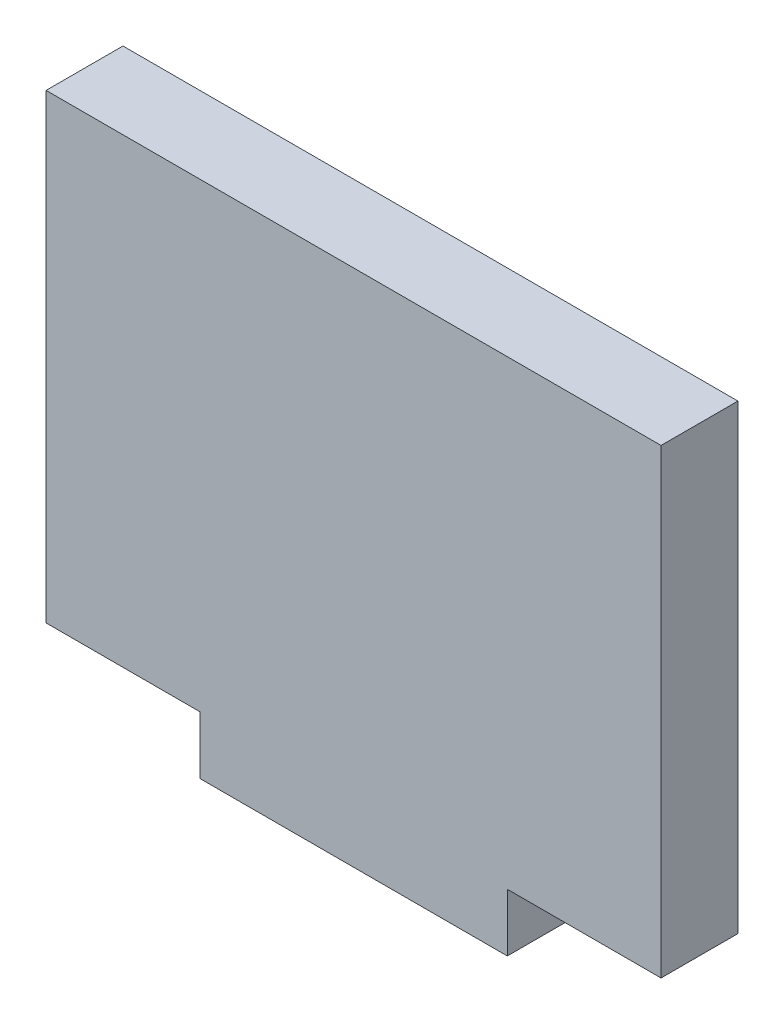
ISO-10303-21;
HEADER;
FILE_DESCRIPTION(('STEP AP214'),'2;1');
FILE_NAME('part.step','',(''),(''),'','','');
FILE_SCHEMA(('AUTOMOTIVE_DESIGN { 1 0 10303 214 1 1 1 1 }'));
ENDSEC;
DATA;
#1=APPLICATION_CONTEXT('core data for automotive mechanical design processes');
#2=APPLICATION_PROTOCOL_DEFINITION('international standard','automotive_design',2000,#1);
#3=PRODUCT_CONTEXT('',#1,'mechanical');
#4=PRODUCT('Part','Part','',(#3));
#5=PRODUCT_RELATED_PRODUCT_CATEGORY('part','',(#4));
#6=PRODUCT_DEFINITION_FORMATION('','',#4);
#7=PRODUCT_DEFINITION_CONTEXT('part definition',#1,'design');
#8=PRODUCT_DEFINITION('design','',#6,#7);
#9=PRODUCT_DEFINITION_SHAPE('','',#8);
#10=(LENGTH_UNIT() NAMED_UNIT(*) SI_UNIT(.MILLI.,.METRE.));
#11=(NAMED_UNIT(*) PLANE_ANGLE_UNIT() SI_UNIT($,.RADIAN.));
#12=(NAMED_UNIT(*) SI_UNIT($,.STERADIAN.) SOLID_ANGLE_UNIT());
#13=UNCERTAINTY_MEASURE_WITH_UNIT(LENGTH_MEASURE(1.E-05),#10,'distance_accuracy_value','');
#14=(GEOMETRIC_REPRESENTATION_CONTEXT(3) GLOBAL_UNCERTAINTY_ASSIGNED_CONTEXT((#13)) GLOBAL_UNIT_ASSIGNED_CONTEXT((#10,
#11,#12)) REPRESENTATION_CONTEXT('',''));
#15=CARTESIAN_POINT('',(0.,0.,0.));
#16=DIRECTION('',(0.,0.,1.));
#17=DIRECTION('',(1.,0.,0.));
#18=AXIS2_PLACEMENT_3D('',#15,#16,#17);
#19=CARTESIAN_POINT('',(0.,0.,3.175));
#20=DIRECTION('',(1.,0.,0.));
#21=DIRECTION('',(0.,1.,0.));
#22=AXIS2_PLACEMENT_3D('',#19,#20,#21);
#23=PLANE('',#22);
#24=DIRECTION('',(0.,-1.,0.));
#25=VECTOR('',#24,1.);
#26=CARTESIAN_POINT('',(0.,0.,0.));
#27=LINE('',#26,#25);
#28=CARTESIAN_POINT('',(0.,19.05,0.));
#29=VERTEX_POINT('',#28);
#30=CARTESIAN_POINT('',(0.,0.,0.));
#31=VERTEX_POINT('',#30);
#32=EDGE_CURVE('E129',#29,#31,#27,.T.);
#33=ORIENTED_EDGE('',*,*,#32,.T.);
#34=DIRECTION('',(0.,0.,-1.));
#35=VECTOR('',#34,1.);
#36=CARTESIAN_POINT('',(0.,0.,3.175));
#37=LINE('',#36,#35);
#38=CARTESIAN_POINT('',(0.,0.,3.175));
#39=VERTEX_POINT('',#38);
#40=EDGE_CURVE('E11',#39,#31,#37,.T.);
#41=ORIENTED_EDGE('',*,*,#40,.F.);
#42=DIRECTION('',(0.,-1.,0.));
#43=VECTOR('',#42,1.);
#44=CARTESIAN_POINT('',(0.,0.,3.175));
#45=LINE('',#44,#43);
#46=CARTESIAN_POINT('',(0.,19.05,3.175));
#47=VERTEX_POINT('',#46);
#48=EDGE_CURVE('E143',#47,#39,#45,.T.);
#49=ORIENTED_EDGE('',*,*,#48,.F.);
#50=DIRECTION('',(0.,0.,-1.));
#51=VECTOR('',#50,1.);
#52=CARTESIAN_POINT('',(0.,19.05,3.175));
#53=LINE('',#52,#51);
#54=EDGE_CURVE('E125',#47,#29,#53,.T.);
#55=ORIENTED_EDGE('',*,*,#54,.T.);
#56=EDGE_LOOP('',(#33,#41,#49,#55));
#57=FACE_BOUND('',#56,.T.);
#58=ADVANCED_FACE('F33',(#57),#23,.F.);
#59=CARTESIAN_POINT('',(0.,0.,3.175));
#60=DIRECTION('',(0.,1.,0.));
#61=DIRECTION('',(0.,0.,1.));
#62=AXIS2_PLACEMENT_3D('',#59,#60,#61);
#63=PLANE('',#62);
#64=DIRECTION('',(1.,0.,0.));
#65=VECTOR('',#64,1.);
#66=CARTESIAN_POINT('',(0.,0.,0.));
#67=LINE('',#66,#65);
#68=CARTESIAN_POINT('',(6.35,0.,0.));
#69=VERTEX_POINT('',#68);
#70=EDGE_CURVE('E132',#31,#69,#67,.T.);
#71=ORIENTED_EDGE('',*,*,#70,.T.);
#72=DIRECTION('',(0.,0.,-1.));
#73=VECTOR('',#72,1.);
#74=CARTESIAN_POINT('',(6.35,0.,3.175));
#75=LINE('',#74,#73);
#76=CARTESIAN_POINT('',(6.35,0.,3.175));
#77=VERTEX_POINT('',#76);
#78=EDGE_CURVE('E41',#77,#69,#75,.T.);
#79=ORIENTED_EDGE('',*,*,#78,.F.);
#80=DIRECTION('',(1.,0.,0.));
#81=VECTOR('',#80,1.);
#82=CARTESIAN_POINT('',(0.,0.,3.175));
#83=LINE('',#82,#81);
#84=EDGE_CURVE('E92',#39,#77,#83,.T.);
#85=ORIENTED_EDGE('',*,*,#84,.F.);
#86=ORIENTED_EDGE('',*,*,#40,.T.);
#87=EDGE_LOOP('',(#71,#79,#85,#86));
#88=FACE_BOUND('',#87,.T.);
#89=ADVANCED_FACE('F178',(#88),#63,.F.);
#90=CARTESIAN_POINT('',(6.35,0.,3.175));
#91=DIRECTION('',(1.,0.,0.));
#92=DIRECTION('',(0.,0.,-1.));
#93=AXIS2_PLACEMENT_3D('',#90,#91,#92);
#94=PLANE('',#93);
#95=DIRECTION('',(0.,-1.,0.));
#96=VECTOR('',#95,1.);
#97=CARTESIAN_POINT('',(6.35,0.,0.));
#98=LINE('',#97,#96);
#99=CARTESIAN_POINT('',(6.35,-2.38793491823931,0.));
#100=VERTEX_POINT('',#99);
#101=EDGE_CURVE('E134',#69,#100,#98,.T.);
#102=ORIENTED_EDGE('',*,*,#101,.T.);
#103=DIRECTION('',(0.,0.,-1.));
#104=VECTOR('',#103,1.);
#105=CARTESIAN_POINT('',(6.35,-2.38793491823931,3.175));
#106=LINE('',#105,#104);
#107=CARTESIAN_POINT('',(6.35,-2.38793491823931,3.175));
#108=VERTEX_POINT('',#107);
#109=EDGE_CURVE('E150',#108,#100,#106,.T.);
#110=ORIENTED_EDGE('',*,*,#109,.F.);
#111=DIRECTION('',(0.,-1.,0.));
#112=VECTOR('',#111,1.);
#113=CARTESIAN_POINT('',(6.35,0.,3.175));
#114=LINE('',#113,#112);
#115=EDGE_CURVE('E158',#77,#108,#114,.T.);
#116=ORIENTED_EDGE('',*,*,#115,.F.);
#117=ORIENTED_EDGE('',*,*,#78,.T.);
#118=EDGE_LOOP('',(#102,#110,#116,#117));
#119=FACE_BOUND('',#118,.T.);
#120=ADVANCED_FACE('F156',(#119),#94,.F.);
#121=CARTESIAN_POINT('',(6.35,-2.38793491823931,3.175));
#122=DIRECTION('',(0.,1.,0.));
#123=DIRECTION('',(0.,0.,1.));
#124=AXIS2_PLACEMENT_3D('',#121,#122,#123);
#125=PLANE('',#124);
#126=DIRECTION('',(1.,0.,0.));
#127=VECTOR('',#126,1.);
#128=CARTESIAN_POINT('',(6.35,-2.38793491823931,0.));
#129=LINE('',#128,#127);
#130=CARTESIAN_POINT('',(19.05,-2.38793491823931,0.));
#131=VERTEX_POINT('',#130);
#132=EDGE_CURVE('E136',#100,#131,#129,.T.);
#133=ORIENTED_EDGE('',*,*,#132,.T.);
#134=DIRECTION('',(0.,0.,-1.));
#135=VECTOR('',#134,1.);
#136=CARTESIAN_POINT('',(19.05,-2.38793491823931,3.175));
#137=LINE('',#136,#135);
#138=CARTESIAN_POINT('',(19.05,-2.38793491823931,3.175));
#139=VERTEX_POINT('',#138);
#140=EDGE_CURVE('E147',#139,#131,#137,.T.);
#141=ORIENTED_EDGE('',*,*,#140,.F.);
#142=DIRECTION('',(1.,0.,0.));
#143=VECTOR('',#142,1.);
#144=CARTESIAN_POINT('',(6.35,-2.38793491823931,3.175));
#145=LINE('',#144,#143);
#146=EDGE_CURVE('E170',#108,#139,#145,.T.);
#147=ORIENTED_EDGE('',*,*,#146,.F.);
#148=ORIENTED_EDGE('',*,*,#109,.T.);
#149=EDGE_LOOP('',(#133,#141,#147,#148));
#150=FACE_BOUND('',#149,.T.);
#151=ADVANCED_FACE('F166',(#150),#125,.F.);
#152=CARTESIAN_POINT('',(19.05,-2.38793491823931,3.175));
#153=DIRECTION('',(-1.,0.,0.));
#154=DIRECTION('',(0.,0.,1.));
#155=AXIS2_PLACEMENT_3D('',#152,#153,#154);
#156=PLANE('',#155);
#157=DIRECTION('',(0.,1.,0.));
#158=VECTOR('',#157,1.);
#159=CARTESIAN_POINT('',(19.05,-2.38793491823931,0.));
#160=LINE('',#159,#158);
#161=CARTESIAN_POINT('',(19.05,0.,0.));
#162=VERTEX_POINT('',#161);
#163=EDGE_CURVE('E138',#131,#162,#160,.T.);
#164=ORIENTED_EDGE('',*,*,#163,.T.);
#165=DIRECTION('',(0.,0.,-1.));
#166=VECTOR('',#165,1.);
#167=CARTESIAN_POINT('',(19.05,0.,3.175));
#168=LINE('',#167,#166);
#169=CARTESIAN_POINT('',(19.05,0.,3.175));
#170=VERTEX_POINT('',#169);
#171=EDGE_CURVE('E120',#170,#162,#168,.T.);
#172=ORIENTED_EDGE('',*,*,#171,.F.);
#173=DIRECTION('',(0.,1.,0.));
#174=VECTOR('',#173,1.);
#175=CARTESIAN_POINT('',(19.05,-2.38793491823931,3.175));
#176=LINE('',#175,#174);
#177=EDGE_CURVE('E111',#139,#170,#176,.T.);
#178=ORIENTED_EDGE('',*,*,#177,.F.);
#179=ORIENTED_EDGE('',*,*,#140,.T.);
#180=EDGE_LOOP('',(#164,#172,#178,#179));
#181=FACE_BOUND('',#180,.T.);
#182=ADVANCED_FACE('F169',(#181),#156,.F.);
#183=CARTESIAN_POINT('',(19.05,0.,3.175));
#184=DIRECTION('',(0.,1.,0.));
#185=DIRECTION('',(0.,0.,1.));
#186=AXIS2_PLACEMENT_3D('',#183,#184,#185);
#187=PLANE('',#186);
#188=DIRECTION('',(1.,0.,0.));
#189=VECTOR('',#188,1.);
#190=CARTESIAN_POINT('',(19.05,0.,0.));
#191=LINE('',#190,#189);
#192=CARTESIAN_POINT('',(25.4,0.,0.));
#193=VERTEX_POINT('',#192);
#194=EDGE_CURVE('E119',#162,#193,#191,.T.);
#195=ORIENTED_EDGE('',*,*,#194,.T.);
#196=DIRECTION('',(0.,0.,-1.));
#197=VECTOR('',#196,1.);
#198=CARTESIAN_POINT('',(25.4,0.,3.175));
#199=LINE('',#198,#197);
#200=CARTESIAN_POINT('',(25.4,0.,3.175));
#201=VERTEX_POINT('',#200);
#202=EDGE_CURVE('E116',#201,#193,#199,.T.);
#203=ORIENTED_EDGE('',*,*,#202,.F.);
#204=DIRECTION('',(1.,0.,0.));
#205=VECTOR('',#204,1.);
#206=CARTESIAN_POINT('',(19.05,0.,3.175));
#207=LINE('',#206,#205);
#208=EDGE_CURVE('E105',#170,#201,#207,.T.);
#209=ORIENTED_EDGE('',*,*,#208,.F.);
#210=ORIENTED_EDGE('',*,*,#171,.T.);
#211=EDGE_LOOP('',(#195,#203,#209,#210));
#212=FACE_BOUND('',#211,.T.);
#213=ADVANCED_FACE('F117',(#212),#187,.F.);
#214=CARTESIAN_POINT('',(25.4,0.,3.175));
#215=DIRECTION('',(-1.,0.,0.));
#216=DIRECTION('',(0.,-1.,0.));
#217=AXIS2_PLACEMENT_3D('',#214,#215,#216);
#218=PLANE('',#217);
#219=DIRECTION('',(0.,1.,0.));
#220=VECTOR('',#219,1.);
#221=CARTESIAN_POINT('',(25.4,0.,0.));
#222=LINE('',#221,#220);
#223=CARTESIAN_POINT('',(25.4,19.05,0.));
#224=VERTEX_POINT('',#223);
#225=EDGE_CURVE('E78',#193,#224,#222,.T.);
#226=ORIENTED_EDGE('',*,*,#225,.T.);
#227=DIRECTION('',(0.,0.,-1.));
#228=VECTOR('',#227,1.);
#229=CARTESIAN_POINT('',(25.4,19.05,3.175));
#230=LINE('',#229,#228);
#231=CARTESIAN_POINT('',(25.4,19.05,3.175));
#232=VERTEX_POINT('',#231);
#233=EDGE_CURVE('E121',#232,#224,#230,.T.);
#234=ORIENTED_EDGE('',*,*,#233,.F.);
#235=DIRECTION('',(0.,1.,0.));
#236=VECTOR('',#235,1.);
#237=CARTESIAN_POINT('',(25.4,0.,3.175));
#238=LINE('',#237,#236);
#239=EDGE_CURVE('E109',#201,#232,#238,.T.);
#240=ORIENTED_EDGE('',*,*,#239,.F.);
#241=ORIENTED_EDGE('',*,*,#202,.T.);
#242=EDGE_LOOP('',(#226,#234,#240,#241));
#243=FACE_BOUND('',#242,.T.);
#244=ADVANCED_FACE('F123',(#243),#218,.F.);
#245=CARTESIAN_POINT('',(0.,19.05,3.175));
#246=DIRECTION('',(0.,-1.,0.));
#247=DIRECTION('',(0.,0.,-1.));
#248=AXIS2_PLACEMENT_3D('',#245,#246,#247);
#249=PLANE('',#248);
#250=DIRECTION('',(-1.,0.,0.));
#251=VECTOR('',#250,1.);
#252=CARTESIAN_POINT('',(0.,19.05,0.));
#253=LINE('',#252,#251);
#254=EDGE_CURVE('E84',#224,#29,#253,.T.);
#255=ORIENTED_EDGE('',*,*,#254,.T.);
#256=ORIENTED_EDGE('',*,*,#54,.F.);
#257=DIRECTION('',(-1.,0.,0.));
#258=VECTOR('',#257,1.);
#259=CARTESIAN_POINT('',(0.,19.05,3.175));
#260=LINE('',#259,#258);
#261=EDGE_CURVE('E49',#232,#47,#260,.T.);
#262=ORIENTED_EDGE('',*,*,#261,.F.);
#263=ORIENTED_EDGE('',*,*,#233,.T.);
#264=EDGE_LOOP('',(#255,#256,#262,#263));
#265=FACE_BOUND('',#264,.T.);
#266=ADVANCED_FACE('F194',(#265),#249,.F.);
#267=CARTESIAN_POINT('',(0.,0.,3.175));
#268=DIRECTION('',(0.,0.,-1.));
#269=DIRECTION('',(-1.,0.,0.));
#270=AXIS2_PLACEMENT_3D('',#267,#268,#269);
#271=PLANE('',#270);
#272=ORIENTED_EDGE('',*,*,#48,.T.);
#273=ORIENTED_EDGE('',*,*,#84,.T.);
#274=ORIENTED_EDGE('',*,*,#115,.T.);
#275=ORIENTED_EDGE('',*,*,#146,.T.);
#276=ORIENTED_EDGE('',*,*,#177,.T.);
#277=ORIENTED_EDGE('',*,*,#208,.T.);
#278=ORIENTED_EDGE('',*,*,#239,.T.);
#279=ORIENTED_EDGE('',*,*,#261,.T.);
#280=EDGE_LOOP('',(#272,#273,#274,#275,#276,#277,#278,#279));
#281=FACE_BOUND('',#280,.T.);
#282=ADVANCED_FACE('F107',(#281),#271,.F.);
#283=CARTESIAN_POINT('',(0.,0.,0.));
#284=DIRECTION('',(0.,0.,-1.));
#285=DIRECTION('',(-1.,0.,0.));
#286=AXIS2_PLACEMENT_3D('',#283,#284,#285);
#287=PLANE('',#286);
#288=ORIENTED_EDGE('',*,*,#32,.F.);
#289=ORIENTED_EDGE('',*,*,#254,.F.);
#290=ORIENTED_EDGE('',*,*,#225,.F.);
#291=ORIENTED_EDGE('',*,*,#194,.F.);
#292=ORIENTED_EDGE('',*,*,#163,.F.);
#293=ORIENTED_EDGE('',*,*,#132,.F.);
#294=ORIENTED_EDGE('',*,*,#101,.F.);
#295=ORIENTED_EDGE('',*,*,#70,.F.);
#296=EDGE_LOOP('',(#288,#289,#290,#291,#292,#293,#294,#295));
#297=FACE_BOUND('',#296,.T.);
#298=ADVANCED_FACE('F162',(#297),#287,.T.);
#299=CLOSED_SHELL('',(#58,#89,#120,#151,#182,#213,#244,#266,#282,#298));
#300=MANIFOLD_SOLID_BREP('B2',#299);
#301=ADVANCED_BREP_SHAPE_REPRESENTATION('',(#18,#300),#14);
#302=SHAPE_DEFINITION_REPRESENTATION(#9,#301);
ENDSEC;
END-ISO-10303-21;
